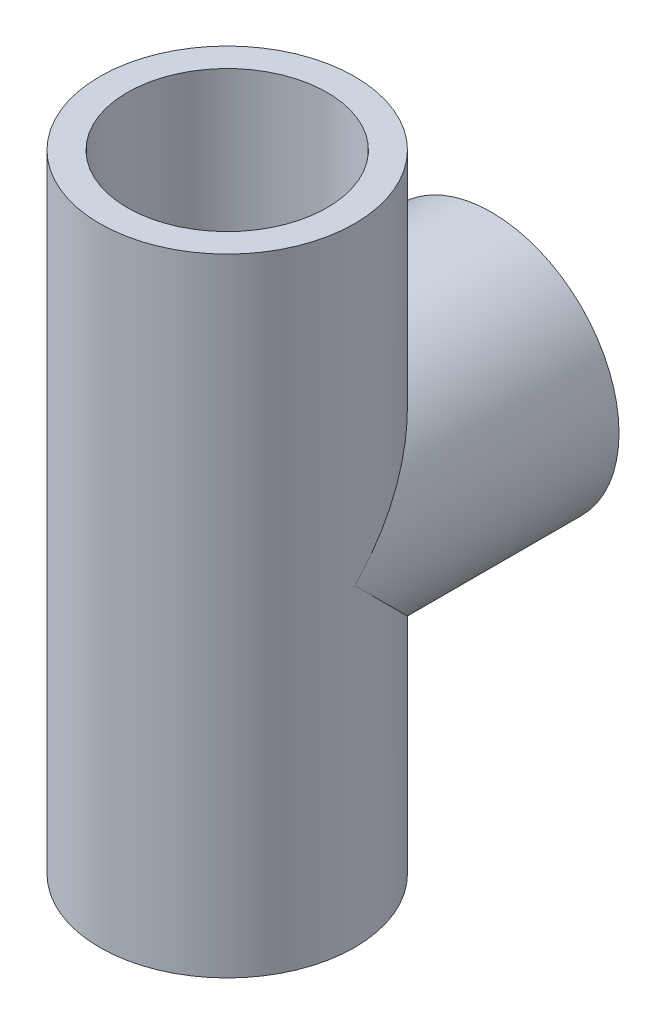
ISO-10303-21;
HEADER;
FILE_DESCRIPTION(('STEP AP214'),'2;1');
FILE_NAME('part.step','',(''),(''),'','','');
FILE_SCHEMA(('AUTOMOTIVE_DESIGN { 1 0 10303 214 1 1 1 1 }'));
ENDSEC;
DATA;
#1=APPLICATION_CONTEXT('core data for automotive mechanical design processes');
#2=APPLICATION_PROTOCOL_DEFINITION('international standard','automotive_design',2000,#1);
#3=PRODUCT_CONTEXT('',#1,'mechanical');
#4=PRODUCT('Part','Part','',(#3));
#5=PRODUCT_RELATED_PRODUCT_CATEGORY('part','',(#4));
#6=PRODUCT_DEFINITION_FORMATION('','',#4);
#7=PRODUCT_DEFINITION_CONTEXT('part definition',#1,'design');
#8=PRODUCT_DEFINITION('design','',#6,#7);
#9=PRODUCT_DEFINITION_SHAPE('','',#8);
#10=(LENGTH_UNIT() NAMED_UNIT(*) SI_UNIT(.MILLI.,.METRE.));
#11=(NAMED_UNIT(*) PLANE_ANGLE_UNIT() SI_UNIT($,.RADIAN.));
#12=(NAMED_UNIT(*) SI_UNIT($,.STERADIAN.) SOLID_ANGLE_UNIT());
#13=UNCERTAINTY_MEASURE_WITH_UNIT(LENGTH_MEASURE(1.E-05),#10,'distance_accuracy_value','');
#14=(GEOMETRIC_REPRESENTATION_CONTEXT(3) GLOBAL_UNCERTAINTY_ASSIGNED_CONTEXT((#13)) GLOBAL_UNIT_ASSIGNED_CONTEXT((#10,
#11,#12)) REPRESENTATION_CONTEXT('',''));
#15=CARTESIAN_POINT('',(0.,0.,0.));
#16=DIRECTION('',(0.,0.,1.));
#17=DIRECTION('',(1.,0.,0.));
#18=AXIS2_PLACEMENT_3D('',#15,#16,#17);
#19=CARTESIAN_POINT('',(0.,42.164,-35.56));
#20=DIRECTION('',(0.,0.,1.));
#21=DIRECTION('',(1.,0.,0.));
#22=AXIS2_PLACEMENT_3D('',#19,#20,#21);
#23=CYLINDRICAL_SURFACE('',#22,11.43);
#24=CARTESIAN_POINT('',(0.,42.164,0.));
#25=DIRECTION('',(0.,-0.707106781186548,-0.707106781186547));
#26=DIRECTION('',(0.,-0.707106781186548,0.707106781186547));
#27=AXIS2_PLACEMENT_3D('',#24,#25,#26);
#28=ELLIPSE('',#27,16.1644610179245,11.43);
#29=CARTESIAN_POINT('',(11.43,42.164,0.));
#30=VERTEX_POINT('',#29);
#31=CARTESIAN_POINT('',(-11.43,42.164,0.));
#32=VERTEX_POINT('',#31);
#33=EDGE_CURVE('E53',#30,#32,#28,.F.);
#34=ORIENTED_EDGE('',*,*,#33,.T.);
#35=CARTESIAN_POINT('',(0.,42.164,0.));
#36=DIRECTION('',(0.,-0.707106781186548,0.707106781186547));
#37=DIRECTION('',(0.,-0.707106781186548,-0.707106781186547));
#38=AXIS2_PLACEMENT_3D('',#35,#36,#37);
#39=ELLIPSE('',#38,16.1644610179245,11.43);
#40=EDGE_CURVE('E65',#32,#30,#39,.T.);
#41=ORIENTED_EDGE('',*,*,#40,.T.);
#42=EDGE_LOOP('',(#34,#41));
#43=FACE_BOUND('',#42,.T.);
#44=CARTESIAN_POINT('',(0.,42.164,-14.9225));
#45=DIRECTION('',(0.,0.,-1.));
#46=DIRECTION('',(-1.,0.,0.));
#47=AXIS2_PLACEMENT_3D('',#44,#45,#46);
#48=CIRCLE('',#47,11.43);
#49=CARTESIAN_POINT('',(-11.43,42.164,-14.9225));
#50=VERTEX_POINT('',#49);
#51=EDGE_CURVE('E41',#50,#50,#48,.F.);
#52=ORIENTED_EDGE('',*,*,#51,.F.);
#53=EDGE_LOOP('',(#52));
#54=FACE_BOUND('',#53,.T.);
#55=ADVANCED_FACE('F37',(#43,#54),#23,.F.);
#56=CARTESIAN_POINT('',(0.,84.328,0.));
#57=DIRECTION('',(0.,-1.,0.));
#58=DIRECTION('',(0.,0.,-1.));
#59=AXIS2_PLACEMENT_3D('',#56,#57,#58);
#60=CYLINDRICAL_SURFACE('',#59,11.43);
#61=CARTESIAN_POINT('',(0.,63.6905,0.));
#62=DIRECTION('',(0.,1.,0.));
#63=DIRECTION('',(0.,0.,1.));
#64=AXIS2_PLACEMENT_3D('',#61,#62,#63);
#65=CIRCLE('',#64,11.43);
#66=CARTESIAN_POINT('',(0.,63.6905,11.43));
#67=VERTEX_POINT('',#66);
#68=EDGE_CURVE('E68',#67,#67,#65,.T.);
#69=ORIENTED_EDGE('',*,*,#68,.T.);
#70=EDGE_LOOP('',(#69));
#71=FACE_BOUND('',#70,.T.);
#72=ORIENTED_EDGE('',*,*,#33,.F.);
#73=ORIENTED_EDGE('',*,*,#40,.F.);
#74=EDGE_LOOP('',(#72,#73));
#75=FACE_BOUND('',#74,.T.);
#76=CARTESIAN_POINT('',(0.,20.6375,0.));
#77=DIRECTION('',(0.,-1.,0.));
#78=DIRECTION('',(0.,0.,-1.));
#79=AXIS2_PLACEMENT_3D('',#76,#77,#78);
#80=CIRCLE('',#79,11.43);
#81=CARTESIAN_POINT('',(0.,20.6375,-11.43));
#82=VERTEX_POINT('',#81);
#83=EDGE_CURVE('E85',#82,#82,#80,.T.);
#84=ORIENTED_EDGE('',*,*,#83,.T.);
#85=EDGE_LOOP('',(#84));
#86=FACE_BOUND('',#85,.T.);
#87=ADVANCED_FACE('F70',(#71,#75,#86),#60,.F.);
#88=CARTESIAN_POINT('',(0.,84.328,0.));
#89=DIRECTION('',(0.,1.,0.));
#90=DIRECTION('',(0.,0.,1.));
#91=AXIS2_PLACEMENT_3D('',#88,#89,#90);
#92=PLANE('',#91);
#93=CARTESIAN_POINT('',(0.,84.328,0.));
#94=DIRECTION('',(0.,1.,0.));
#95=DIRECTION('',(0.,0.,1.));
#96=AXIS2_PLACEMENT_3D('',#93,#94,#95);
#97=CIRCLE('',#96,13.4366);
#98=CARTESIAN_POINT('',(0.,84.328,13.4366));
#99=VERTEX_POINT('',#98);
#100=EDGE_CURVE('E87',#99,#99,#97,.T.);
#101=ORIENTED_EDGE('',*,*,#100,.F.);
#102=EDGE_LOOP('',(#101));
#103=FACE_BOUND('',#102,.T.);
#104=CARTESIAN_POINT('',(0.,84.328,0.));
#105=DIRECTION('',(0.,1.,0.));
#106=DIRECTION('',(0.,0.,1.));
#107=AXIS2_PLACEMENT_3D('',#104,#105,#106);
#108=CIRCLE('',#107,17.145);
#109=CARTESIAN_POINT('',(0.,84.328,17.145));
#110=VERTEX_POINT('',#109);
#111=EDGE_CURVE('E11',#110,#110,#108,.T.);
#112=ORIENTED_EDGE('',*,*,#111,.T.);
#113=EDGE_LOOP('',(#112));
#114=FACE_BOUND('',#113,.T.);
#115=ADVANCED_FACE('F114',(#103,#114),#92,.T.);
#116=CARTESIAN_POINT('',(0.,0.,0.));
#117=DIRECTION('',(0.,1.,0.));
#118=DIRECTION('',(0.,0.,1.));
#119=AXIS2_PLACEMENT_3D('',#116,#117,#118);
#120=PLANE('',#119);
#121=CARTESIAN_POINT('',(0.,0.,0.));
#122=DIRECTION('',(0.,-1.,0.));
#123=DIRECTION('',(0.,0.,-1.));
#124=AXIS2_PLACEMENT_3D('',#121,#122,#123);
#125=CIRCLE('',#124,13.4366);
#126=CARTESIAN_POINT('',(0.,0.,-13.4366));
#127=VERTEX_POINT('',#126);
#128=EDGE_CURVE('E92',#127,#127,#125,.T.);
#129=ORIENTED_EDGE('',*,*,#128,.F.);
#130=EDGE_LOOP('',(#129));
#131=FACE_BOUND('',#130,.T.);
#132=CARTESIAN_POINT('',(0.,0.,0.));
#133=DIRECTION('',(0.,1.,0.));
#134=DIRECTION('',(0.,0.,1.));
#135=AXIS2_PLACEMENT_3D('',#132,#133,#134);
#136=CIRCLE('',#135,17.145);
#137=CARTESIAN_POINT('',(0.,0.,17.145));
#138=VERTEX_POINT('',#137);
#139=EDGE_CURVE('E46',#138,#138,#136,.T.);
#140=ORIENTED_EDGE('',*,*,#139,.F.);
#141=EDGE_LOOP('',(#140));
#142=FACE_BOUND('',#141,.T.);
#143=ADVANCED_FACE('F117',(#131,#142),#120,.F.);
#144=CARTESIAN_POINT('',(0.,84.328,0.));
#145=DIRECTION('',(0.,-1.,0.));
#146=DIRECTION('',(0.,0.,-1.));
#147=AXIS2_PLACEMENT_3D('',#144,#145,#146);
#148=CYLINDRICAL_SURFACE('',#147,17.145);
#149=CARTESIAN_POINT('',(0.,42.164,0.));
#150=DIRECTION('',(0.,-0.707106781186547,-0.707106781186547));
#151=DIRECTION('',(0.,-0.707106781186547,0.707106781186547));
#152=AXIS2_PLACEMENT_3D('',#149,#150,#151);
#153=ELLIPSE('',#152,24.2466915268867,17.145);
#154=CARTESIAN_POINT('',(17.145,42.164,0.));
#155=VERTEX_POINT('',#154);
#156=CARTESIAN_POINT('',(-17.145,42.164,0.));
#157=VERTEX_POINT('',#156);
#158=EDGE_CURVE('E75',#155,#157,#153,.F.);
#159=ORIENTED_EDGE('',*,*,#158,.T.);
#160=CARTESIAN_POINT('',(0.,42.164,0.));
#161=DIRECTION('',(0.,-0.707106781186547,0.707106781186547));
#162=DIRECTION('',(0.,-0.707106781186547,-0.707106781186547));
#163=AXIS2_PLACEMENT_3D('',#160,#161,#162);
#164=ELLIPSE('',#163,24.2466915268867,17.145);
#165=EDGE_CURVE('E60',#157,#155,#164,.T.);
#166=ORIENTED_EDGE('',*,*,#165,.T.);
#167=EDGE_LOOP('',(#159,#166));
#168=FACE_BOUND('',#167,.T.);
#169=ORIENTED_EDGE('',*,*,#111,.F.);
#170=EDGE_LOOP('',(#169));
#171=FACE_BOUND('',#170,.T.);
#172=ORIENTED_EDGE('',*,*,#139,.T.);
#173=EDGE_LOOP('',(#172));
#174=FACE_BOUND('',#173,.T.);
#175=ADVANCED_FACE('F39',(#168,#171,#174),#148,.T.);
#176=CARTESIAN_POINT('',(0.,42.164,-35.56));
#177=DIRECTION('',(0.,0.,1.));
#178=DIRECTION('',(1.,0.,0.));
#179=AXIS2_PLACEMENT_3D('',#176,#177,#178);
#180=CYLINDRICAL_SURFACE('',#179,17.145);
#181=CARTESIAN_POINT('',(0.,42.164,-35.56));
#182=DIRECTION('',(0.,0.,1.));
#183=DIRECTION('',(1.,0.,0.));
#184=AXIS2_PLACEMENT_3D('',#181,#182,#183);
#185=CIRCLE('',#184,17.145);
#186=CARTESIAN_POINT('',(17.145,42.164,-35.56));
#187=VERTEX_POINT('',#186);
#188=EDGE_CURVE('E72',#187,#187,#185,.T.);
#189=ORIENTED_EDGE('',*,*,#188,.T.);
#190=EDGE_LOOP('',(#189));
#191=FACE_BOUND('',#190,.T.);
#192=ORIENTED_EDGE('',*,*,#165,.F.);
#193=ORIENTED_EDGE('',*,*,#158,.F.);
#194=EDGE_LOOP('',(#192,#193));
#195=FACE_BOUND('',#194,.T.);
#196=ADVANCED_FACE('F123',(#191,#195),#180,.T.);
#197=CARTESIAN_POINT('',(0.,42.164,-35.56));
#198=DIRECTION('',(0.,0.,1.));
#199=DIRECTION('',(1.,0.,0.));
#200=AXIS2_PLACEMENT_3D('',#197,#198,#199);
#201=PLANE('',#200);
#202=CARTESIAN_POINT('',(0.,42.164,-35.56));
#203=DIRECTION('',(0.,0.,-1.));
#204=DIRECTION('',(-1.,0.,0.));
#205=AXIS2_PLACEMENT_3D('',#202,#203,#204);
#206=CIRCLE('',#205,13.4366);
#207=CARTESIAN_POINT('',(-13.4366,42.164,-35.56));
#208=VERTEX_POINT('',#207);
#209=EDGE_CURVE('E99',#208,#208,#206,.T.);
#210=ORIENTED_EDGE('',*,*,#209,.F.);
#211=EDGE_LOOP('',(#210));
#212=FACE_BOUND('',#211,.T.);
#213=ORIENTED_EDGE('',*,*,#188,.F.);
#214=EDGE_LOOP('',(#213));
#215=FACE_BOUND('',#214,.T.);
#216=ADVANCED_FACE('F110',(#212,#215),#201,.F.);
#217=CARTESIAN_POINT('',(0.,63.6905,0.));
#218=DIRECTION('',(0.,1.,0.));
#219=DIRECTION('',(0.,0.,1.));
#220=AXIS2_PLACEMENT_3D('',#217,#218,#219);
#221=CYLINDRICAL_SURFACE('',#220,13.4366);
#222=CARTESIAN_POINT('',(0.,63.6905,0.));
#223=DIRECTION('',(0.,1.,0.));
#224=DIRECTION('',(0.,0.,1.));
#225=AXIS2_PLACEMENT_3D('',#222,#223,#224);
#226=CIRCLE('',#225,13.4366);
#227=CARTESIAN_POINT('',(0.,63.6905,13.4366));
#228=VERTEX_POINT('',#227);
#229=EDGE_CURVE('E84',#228,#228,#226,.T.);
#230=ORIENTED_EDGE('',*,*,#229,.F.);
#231=EDGE_LOOP('',(#230));
#232=FACE_BOUND('',#231,.T.);
#233=ORIENTED_EDGE('',*,*,#100,.T.);
#234=EDGE_LOOP('',(#233));
#235=FACE_BOUND('',#234,.T.);
#236=ADVANCED_FACE('F107',(#232,#235),#221,.F.);
#237=CARTESIAN_POINT('',(0.,63.6905,0.));
#238=DIRECTION('',(0.,1.,0.));
#239=DIRECTION('',(0.,0.,1.));
#240=AXIS2_PLACEMENT_3D('',#237,#238,#239);
#241=PLANE('',#240);
#242=ORIENTED_EDGE('',*,*,#68,.F.);
#243=EDGE_LOOP('',(#242));
#244=FACE_BOUND('',#243,.T.);
#245=ORIENTED_EDGE('',*,*,#229,.T.);
#246=EDGE_LOOP('',(#245));
#247=FACE_BOUND('',#246,.T.);
#248=ADVANCED_FACE('F105',(#244,#247),#241,.T.);
#249=CARTESIAN_POINT('',(0.,20.6375,0.));
#250=DIRECTION('',(0.,-1.,0.));
#251=DIRECTION('',(0.,0.,-1.));
#252=AXIS2_PLACEMENT_3D('',#249,#250,#251);
#253=CYLINDRICAL_SURFACE('',#252,13.4366);
#254=CARTESIAN_POINT('',(0.,20.6375,0.));
#255=DIRECTION('',(0.,-1.,0.));
#256=DIRECTION('',(0.,0.,-1.));
#257=AXIS2_PLACEMENT_3D('',#254,#255,#256);
#258=CIRCLE('',#257,13.4366);
#259=CARTESIAN_POINT('',(0.,20.6375,-13.4366));
#260=VERTEX_POINT('',#259);
#261=EDGE_CURVE('E88',#260,#260,#258,.T.);
#262=ORIENTED_EDGE('',*,*,#261,.F.);
#263=EDGE_LOOP('',(#262));
#264=FACE_BOUND('',#263,.T.);
#265=ORIENTED_EDGE('',*,*,#128,.T.);
#266=EDGE_LOOP('',(#265));
#267=FACE_BOUND('',#266,.T.);
#268=ADVANCED_FACE('F169',(#264,#267),#253,.F.);
#269=CARTESIAN_POINT('',(0.,20.6375,0.));
#270=DIRECTION('',(0.,-1.,0.));
#271=DIRECTION('',(0.,0.,-1.));
#272=AXIS2_PLACEMENT_3D('',#269,#270,#271);
#273=PLANE('',#272);
#274=ORIENTED_EDGE('',*,*,#83,.F.);
#275=EDGE_LOOP('',(#274));
#276=FACE_BOUND('',#275,.T.);
#277=ORIENTED_EDGE('',*,*,#261,.T.);
#278=EDGE_LOOP('',(#277));
#279=FACE_BOUND('',#278,.T.);
#280=ADVANCED_FACE('F177',(#276,#279),#273,.T.);
#281=CARTESIAN_POINT('',(0.,42.164,-14.9225));
#282=DIRECTION('',(0.,0.,-1.));
#283=DIRECTION('',(-1.,0.,0.));
#284=AXIS2_PLACEMENT_3D('',#281,#282,#283);
#285=PLANE('',#284);
#286=CARTESIAN_POINT('',(0.,42.164,-14.9225));
#287=DIRECTION('',(0.,0.,-1.));
#288=DIRECTION('',(-1.,0.,0.));
#289=AXIS2_PLACEMENT_3D('',#286,#287,#288);
#290=CIRCLE('',#289,13.4366);
#291=CARTESIAN_POINT('',(-13.4366,42.164,-14.9225));
#292=VERTEX_POINT('',#291);
#293=EDGE_CURVE('E263',#292,#292,#290,.T.);
#294=ORIENTED_EDGE('',*,*,#293,.T.);
#295=EDGE_LOOP('',(#294));
#296=FACE_BOUND('',#295,.T.);
#297=ORIENTED_EDGE('',*,*,#51,.T.);
#298=EDGE_LOOP('',(#297));
#299=FACE_BOUND('',#298,.T.);
#300=ADVANCED_FACE('F185',(#296,#299),#285,.T.);
#301=CARTESIAN_POINT('',(0.,42.164,-14.9225));
#302=DIRECTION('',(0.,0.,-1.));
#303=DIRECTION('',(-1.,0.,0.));
#304=AXIS2_PLACEMENT_3D('',#301,#302,#303);
#305=CYLINDRICAL_SURFACE('',#304,13.4366);
#306=ORIENTED_EDGE('',*,*,#293,.F.);
#307=EDGE_LOOP('',(#306));
#308=FACE_BOUND('',#307,.T.);
#309=ORIENTED_EDGE('',*,*,#209,.T.);
#310=EDGE_LOOP('',(#309));
#311=FACE_BOUND('',#310,.T.);
#312=ADVANCED_FACE('F194',(#308,#311),#305,.F.);
#313=CLOSED_SHELL('',(#55,#87,#115,#143,#175,#196,#216,#236,#248,#268,#280,#300,#312));
#314=MANIFOLD_SOLID_BREP('B2',#313);
#315=ADVANCED_BREP_SHAPE_REPRESENTATION('',(#18,#314),#14);
#316=SHAPE_DEFINITION_REPRESENTATION(#9,#315);
ENDSEC;
END-ISO-10303-21;
